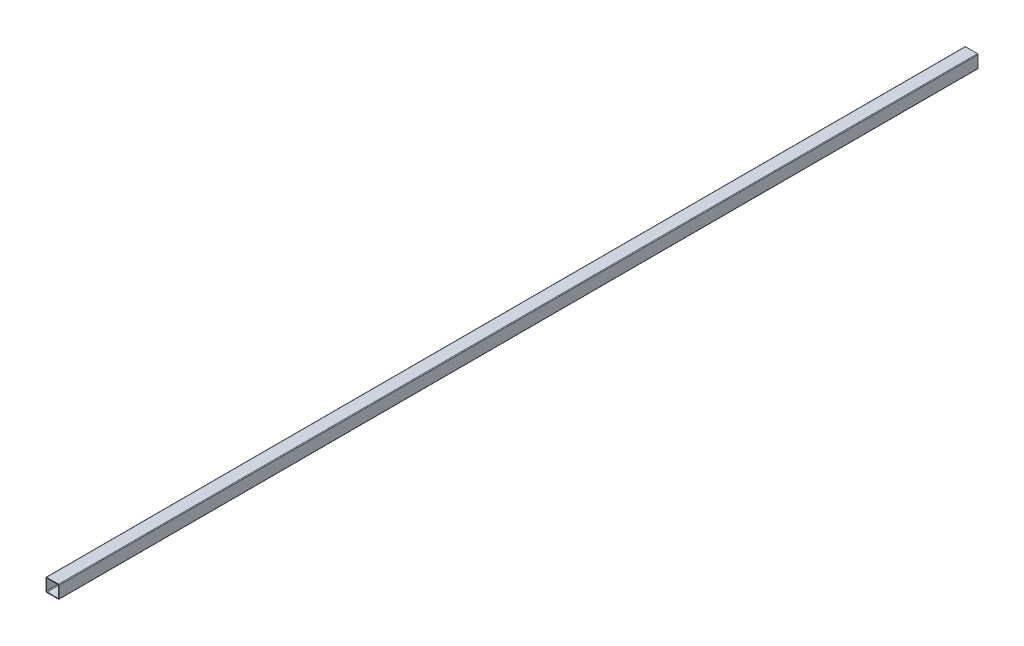
ISO-10303-21;
HEADER;
FILE_DESCRIPTION(('STEP AP214'),'2;1');
FILE_NAME('part.step','',(''),(''),'','','');
FILE_SCHEMA(('AUTOMOTIVE_DESIGN { 1 0 10303 214 1 1 1 1 }'));
ENDSEC;
DATA;
#1=APPLICATION_CONTEXT('core data for automotive mechanical design processes');
#2=APPLICATION_PROTOCOL_DEFINITION('international standard','automotive_design',2000,#1);
#3=PRODUCT_CONTEXT('',#1,'mechanical');
#4=PRODUCT('Part','Part','',(#3));
#5=PRODUCT_RELATED_PRODUCT_CATEGORY('part','',(#4));
#6=PRODUCT_DEFINITION_FORMATION('','',#4);
#7=PRODUCT_DEFINITION_CONTEXT('part definition',#1,'design');
#8=PRODUCT_DEFINITION('design','',#6,#7);
#9=PRODUCT_DEFINITION_SHAPE('','',#8);
#10=(LENGTH_UNIT() NAMED_UNIT(*) SI_UNIT(.MILLI.,.METRE.));
#11=(NAMED_UNIT(*) PLANE_ANGLE_UNIT() SI_UNIT($,.RADIAN.));
#12=(NAMED_UNIT(*) SI_UNIT($,.STERADIAN.) SOLID_ANGLE_UNIT());
#13=UNCERTAINTY_MEASURE_WITH_UNIT(LENGTH_MEASURE(1.E-05),#10,'distance_accuracy_value','');
#14=(GEOMETRIC_REPRESENTATION_CONTEXT(3) GLOBAL_UNCERTAINTY_ASSIGNED_CONTEXT((#13)) GLOBAL_UNIT_ASSIGNED_CONTEXT((#10,
#11,#12)) REPRESENTATION_CONTEXT('',''));
#15=CARTESIAN_POINT('',(0.,0.,0.));
#16=DIRECTION('',(0.,0.,1.));
#17=DIRECTION('',(1.,0.,0.));
#18=AXIS2_PLACEMENT_3D('',#15,#16,#17);
#19=CARTESIAN_POINT('',(18.,18.,2800.));
#20=DIRECTION('',(0.,0.,1.));
#21=DIRECTION('',(1.,0.,0.));
#22=AXIS2_PLACEMENT_3D('',#19,#20,#21);
#23=PLANE('',#22);
#24=CARTESIAN_POINT('',(18.,18.,2800.));
#25=DIRECTION('',(0.,0.,1.));
#26=DIRECTION('',(1.,0.,0.));
#27=AXIS2_PLACEMENT_3D('',#24,#25,#26);
#28=CIRCLE('',#27,2.);
#29=CARTESIAN_POINT('',(20.,18.,2800.));
#30=VERTEX_POINT('',#29);
#31=CARTESIAN_POINT('',(18.,20.,2800.));
#32=VERTEX_POINT('',#31);
#33=EDGE_CURVE('E212',#30,#32,#28,.T.);
#34=ORIENTED_EDGE('',*,*,#33,.T.);
#35=DIRECTION('',(-1.,0.,0.));
#36=VECTOR('',#35,1.);
#37=CARTESIAN_POINT('',(18.,20.,2800.));
#38=LINE('',#37,#36);
#39=CARTESIAN_POINT('',(-18.,20.,2800.));
#40=VERTEX_POINT('',#39);
#41=EDGE_CURVE('E215',#32,#40,#38,.T.);
#42=ORIENTED_EDGE('',*,*,#41,.T.);
#43=CARTESIAN_POINT('',(-18.,18.,2800.));
#44=DIRECTION('',(0.,0.,1.));
#45=DIRECTION('',(1.,0.,0.));
#46=AXIS2_PLACEMENT_3D('',#43,#44,#45);
#47=CIRCLE('',#46,2.);
#48=CARTESIAN_POINT('',(-20.,18.,2800.));
#49=VERTEX_POINT('',#48);
#50=EDGE_CURVE('E218',#40,#49,#47,.T.);
#51=ORIENTED_EDGE('',*,*,#50,.T.);
#52=DIRECTION('',(0.,-1.,0.));
#53=VECTOR('',#52,1.);
#54=CARTESIAN_POINT('',(-20.,-18.,2800.));
#55=LINE('',#54,#53);
#56=CARTESIAN_POINT('',(-20.,-18.,2800.));
#57=VERTEX_POINT('',#56);
#58=EDGE_CURVE('E220',#49,#57,#55,.T.);
#59=ORIENTED_EDGE('',*,*,#58,.T.);
#60=CARTESIAN_POINT('',(-18.,-18.,2800.));
#61=DIRECTION('',(0.,0.,1.));
#62=DIRECTION('',(-1.,0.,0.));
#63=AXIS2_PLACEMENT_3D('',#60,#61,#62);
#64=CIRCLE('',#63,2.);
#65=CARTESIAN_POINT('',(-18.,-20.,2800.));
#66=VERTEX_POINT('',#65);
#67=EDGE_CURVE('E222',#57,#66,#64,.T.);
#68=ORIENTED_EDGE('',*,*,#67,.T.);
#69=DIRECTION('',(1.,0.,0.));
#70=VECTOR('',#69,1.);
#71=CARTESIAN_POINT('',(18.,-20.,2800.));
#72=LINE('',#71,#70);
#73=CARTESIAN_POINT('',(18.,-20.,2800.));
#74=VERTEX_POINT('',#73);
#75=EDGE_CURVE('E224',#66,#74,#72,.T.);
#76=ORIENTED_EDGE('',*,*,#75,.T.);
#77=CARTESIAN_POINT('',(18.,-18.,2800.));
#78=DIRECTION('',(0.,0.,1.));
#79=DIRECTION('',(1.,0.,0.));
#80=AXIS2_PLACEMENT_3D('',#77,#78,#79);
#81=CIRCLE('',#80,2.);
#82=CARTESIAN_POINT('',(20.,-18.,2800.));
#83=VERTEX_POINT('',#82);
#84=EDGE_CURVE('E226',#74,#83,#81,.T.);
#85=ORIENTED_EDGE('',*,*,#84,.T.);
#86=DIRECTION('',(0.,1.,0.));
#87=VECTOR('',#86,1.);
#88=CARTESIAN_POINT('',(20.,-18.,2800.));
#89=LINE('',#88,#87);
#90=EDGE_CURVE('E228',#83,#30,#89,.T.);
#91=ORIENTED_EDGE('',*,*,#90,.T.);
#92=EDGE_LOOP('',(#34,#42,#51,#59,#68,#76,#85,#91));
#93=FACE_BOUND('',#92,.T.);
#94=DIRECTION('',(-1.,0.,0.));
#95=VECTOR('',#94,1.);
#96=CARTESIAN_POINT('',(16.,18.,2800.));
#97=LINE('',#96,#95);
#98=CARTESIAN_POINT('',(16.,18.,2800.));
#99=VERTEX_POINT('',#98);
#100=CARTESIAN_POINT('',(-16.,18.,2800.));
#101=VERTEX_POINT('',#100);
#102=EDGE_CURVE('E155',#99,#101,#97,.T.);
#103=ORIENTED_EDGE('',*,*,#102,.F.);
#104=CARTESIAN_POINT('',(16.,16.,2800.));
#105=DIRECTION('',(0.,0.,1.));
#106=DIRECTION('',(1.,0.,0.));
#107=AXIS2_PLACEMENT_3D('',#104,#105,#106);
#108=CIRCLE('',#107,2.);
#109=CARTESIAN_POINT('',(18.,16.,2800.));
#110=VERTEX_POINT('',#109);
#111=EDGE_CURVE('E147',#110,#99,#108,.T.);
#112=ORIENTED_EDGE('',*,*,#111,.F.);
#113=DIRECTION('',(0.,1.,0.));
#114=VECTOR('',#113,1.);
#115=CARTESIAN_POINT('',(18.,-16.,2800.));
#116=LINE('',#115,#114);
#117=CARTESIAN_POINT('',(18.,-16.,2800.));
#118=VERTEX_POINT('',#117);
#119=EDGE_CURVE('E180',#118,#110,#116,.T.);
#120=ORIENTED_EDGE('',*,*,#119,.F.);
#121=CARTESIAN_POINT('',(16.,-16.,2800.));
#122=DIRECTION('',(0.,0.,1.));
#123=DIRECTION('',(1.,0.,0.));
#124=AXIS2_PLACEMENT_3D('',#121,#122,#123);
#125=CIRCLE('',#124,2.);
#126=CARTESIAN_POINT('',(16.,-18.,2800.));
#127=VERTEX_POINT('',#126);
#128=EDGE_CURVE('E178',#127,#118,#125,.T.);
#129=ORIENTED_EDGE('',*,*,#128,.F.);
#130=DIRECTION('',(1.,0.,0.));
#131=VECTOR('',#130,1.);
#132=CARTESIAN_POINT('',(16.,-18.,2800.));
#133=LINE('',#132,#131);
#134=CARTESIAN_POINT('',(-16.,-18.,2800.));
#135=VERTEX_POINT('',#134);
#136=EDGE_CURVE('E176',#135,#127,#133,.T.);
#137=ORIENTED_EDGE('',*,*,#136,.F.);
#138=CARTESIAN_POINT('',(-16.,-16.,2800.));
#139=DIRECTION('',(0.,0.,1.));
#140=DIRECTION('',(-1.,0.,0.));
#141=AXIS2_PLACEMENT_3D('',#138,#139,#140);
#142=CIRCLE('',#141,2.);
#143=CARTESIAN_POINT('',(-18.,-16.,2800.));
#144=VERTEX_POINT('',#143);
#145=EDGE_CURVE('E174',#144,#135,#142,.T.);
#146=ORIENTED_EDGE('',*,*,#145,.F.);
#147=DIRECTION('',(0.,-1.,0.));
#148=VECTOR('',#147,1.);
#149=CARTESIAN_POINT('',(-18.,-16.,2800.));
#150=LINE('',#149,#148);
#151=CARTESIAN_POINT('',(-18.,16.,2800.));
#152=VERTEX_POINT('',#151);
#153=EDGE_CURVE('E170',#152,#144,#150,.T.);
#154=ORIENTED_EDGE('',*,*,#153,.F.);
#155=CARTESIAN_POINT('',(-16.,16.,2800.));
#156=DIRECTION('',(0.,0.,1.));
#157=DIRECTION('',(1.,0.,0.));
#158=AXIS2_PLACEMENT_3D('',#155,#156,#157);
#159=CIRCLE('',#158,2.);
#160=EDGE_CURVE('E168',#101,#152,#159,.T.);
#161=ORIENTED_EDGE('',*,*,#160,.F.);
#162=EDGE_LOOP('',(#103,#112,#120,#129,#137,#146,#154,#161));
#163=FACE_BOUND('',#162,.T.);
#164=ADVANCED_FACE('F34',(#93,#163),#23,.T.);
#165=CARTESIAN_POINT('',(18.,18.,0.));
#166=DIRECTION('',(0.,0.,1.));
#167=DIRECTION('',(1.,0.,0.));
#168=AXIS2_PLACEMENT_3D('',#165,#166,#167);
#169=PLANE('',#168);
#170=CARTESIAN_POINT('',(18.,18.,0.));
#171=DIRECTION('',(0.,0.,1.));
#172=DIRECTION('',(1.,0.,0.));
#173=AXIS2_PLACEMENT_3D('',#170,#171,#172);
#174=CIRCLE('',#173,2.);
#175=CARTESIAN_POINT('',(20.,18.,0.));
#176=VERTEX_POINT('',#175);
#177=CARTESIAN_POINT('',(18.,20.,0.));
#178=VERTEX_POINT('',#177);
#179=EDGE_CURVE('E163',#176,#178,#174,.T.);
#180=ORIENTED_EDGE('',*,*,#179,.F.);
#181=DIRECTION('',(0.,1.,0.));
#182=VECTOR('',#181,1.);
#183=CARTESIAN_POINT('',(20.,-18.,0.));
#184=LINE('',#183,#182);
#185=CARTESIAN_POINT('',(20.,-18.,0.));
#186=VERTEX_POINT('',#185);
#187=EDGE_CURVE('E216',#186,#176,#184,.T.);
#188=ORIENTED_EDGE('',*,*,#187,.F.);
#189=CARTESIAN_POINT('',(18.,-18.,0.));
#190=DIRECTION('',(0.,0.,1.));
#191=DIRECTION('',(1.,0.,0.));
#192=AXIS2_PLACEMENT_3D('',#189,#190,#191);
#193=CIRCLE('',#192,2.);
#194=CARTESIAN_POINT('',(18.,-20.,0.));
#195=VERTEX_POINT('',#194);
#196=EDGE_CURVE('E243',#195,#186,#193,.T.);
#197=ORIENTED_EDGE('',*,*,#196,.F.);
#198=DIRECTION('',(1.,0.,0.));
#199=VECTOR('',#198,1.);
#200=CARTESIAN_POINT('',(18.,-20.,0.));
#201=LINE('',#200,#199);
#202=CARTESIAN_POINT('',(-18.,-20.,0.));
#203=VERTEX_POINT('',#202);
#204=EDGE_CURVE('E241',#203,#195,#201,.T.);
#205=ORIENTED_EDGE('',*,*,#204,.F.);
#206=CARTESIAN_POINT('',(-18.,-18.,0.));
#207=DIRECTION('',(0.,0.,1.));
#208=DIRECTION('',(-1.,0.,0.));
#209=AXIS2_PLACEMENT_3D('',#206,#207,#208);
#210=CIRCLE('',#209,2.);
#211=CARTESIAN_POINT('',(-20.,-18.,0.));
#212=VERTEX_POINT('',#211);
#213=EDGE_CURVE('E239',#212,#203,#210,.T.);
#214=ORIENTED_EDGE('',*,*,#213,.F.);
#215=DIRECTION('',(0.,-1.,0.));
#216=VECTOR('',#215,1.);
#217=CARTESIAN_POINT('',(-20.,-18.,0.));
#218=LINE('',#217,#216);
#219=CARTESIAN_POINT('',(-20.,18.,0.));
#220=VERTEX_POINT('',#219);
#221=EDGE_CURVE('E237',#220,#212,#218,.T.);
#222=ORIENTED_EDGE('',*,*,#221,.F.);
#223=CARTESIAN_POINT('',(-18.,18.,0.));
#224=DIRECTION('',(0.,0.,1.));
#225=DIRECTION('',(1.,0.,0.));
#226=AXIS2_PLACEMENT_3D('',#223,#224,#225);
#227=CIRCLE('',#226,2.);
#228=CARTESIAN_POINT('',(-18.,20.,0.));
#229=VERTEX_POINT('',#228);
#230=EDGE_CURVE('E235',#229,#220,#227,.T.);
#231=ORIENTED_EDGE('',*,*,#230,.F.);
#232=DIRECTION('',(-1.,0.,0.));
#233=VECTOR('',#232,1.);
#234=CARTESIAN_POINT('',(18.,20.,0.));
#235=LINE('',#234,#233);
#236=EDGE_CURVE('E233',#178,#229,#235,.T.);
#237=ORIENTED_EDGE('',*,*,#236,.F.);
#238=EDGE_LOOP('',(#180,#188,#197,#205,#214,#222,#231,#237));
#239=FACE_BOUND('',#238,.T.);
#240=CARTESIAN_POINT('',(16.,16.,0.));
#241=DIRECTION('',(0.,0.,1.));
#242=DIRECTION('',(1.,0.,0.));
#243=AXIS2_PLACEMENT_3D('',#240,#241,#242);
#244=CIRCLE('',#243,2.);
#245=CARTESIAN_POINT('',(18.,16.,0.));
#246=VERTEX_POINT('',#245);
#247=CARTESIAN_POINT('',(16.,18.,0.));
#248=VERTEX_POINT('',#247);
#249=EDGE_CURVE('E57',#246,#248,#244,.T.);
#250=ORIENTED_EDGE('',*,*,#249,.T.);
#251=DIRECTION('',(-1.,0.,0.));
#252=VECTOR('',#251,1.);
#253=CARTESIAN_POINT('',(16.,18.,0.));
#254=LINE('',#253,#252);
#255=CARTESIAN_POINT('',(-16.,18.,0.));
#256=VERTEX_POINT('',#255);
#257=EDGE_CURVE('E162',#248,#256,#254,.T.);
#258=ORIENTED_EDGE('',*,*,#257,.T.);
#259=CARTESIAN_POINT('',(-16.,16.,0.));
#260=DIRECTION('',(0.,0.,1.));
#261=DIRECTION('',(1.,0.,0.));
#262=AXIS2_PLACEMENT_3D('',#259,#260,#261);
#263=CIRCLE('',#262,2.);
#264=CARTESIAN_POINT('',(-18.,16.,0.));
#265=VERTEX_POINT('',#264);
#266=EDGE_CURVE('E184',#256,#265,#263,.T.);
#267=ORIENTED_EDGE('',*,*,#266,.T.);
#268=DIRECTION('',(0.,-1.,0.));
#269=VECTOR('',#268,1.);
#270=CARTESIAN_POINT('',(-18.,-16.,0.));
#271=LINE('',#270,#269);
#272=CARTESIAN_POINT('',(-18.,-16.,0.));
#273=VERTEX_POINT('',#272);
#274=EDGE_CURVE('E187',#265,#273,#271,.T.);
#275=ORIENTED_EDGE('',*,*,#274,.T.);
#276=CARTESIAN_POINT('',(-16.,-16.,0.));
#277=DIRECTION('',(0.,0.,1.));
#278=DIRECTION('',(-1.,0.,0.));
#279=AXIS2_PLACEMENT_3D('',#276,#277,#278);
#280=CIRCLE('',#279,2.);
#281=CARTESIAN_POINT('',(-16.,-18.,0.));
#282=VERTEX_POINT('',#281);
#283=EDGE_CURVE('E190',#273,#282,#280,.T.);
#284=ORIENTED_EDGE('',*,*,#283,.T.);
#285=DIRECTION('',(1.,0.,0.));
#286=VECTOR('',#285,1.);
#287=CARTESIAN_POINT('',(16.,-18.,0.));
#288=LINE('',#287,#286);
#289=CARTESIAN_POINT('',(16.,-18.,0.));
#290=VERTEX_POINT('',#289);
#291=EDGE_CURVE('E193',#282,#290,#288,.T.);
#292=ORIENTED_EDGE('',*,*,#291,.T.);
#293=CARTESIAN_POINT('',(16.,-16.,0.));
#294=DIRECTION('',(0.,0.,1.));
#295=DIRECTION('',(1.,0.,0.));
#296=AXIS2_PLACEMENT_3D('',#293,#294,#295);
#297=CIRCLE('',#296,2.);
#298=CARTESIAN_POINT('',(18.,-16.,0.));
#299=VERTEX_POINT('',#298);
#300=EDGE_CURVE('E196',#290,#299,#297,.T.);
#301=ORIENTED_EDGE('',*,*,#300,.T.);
#302=DIRECTION('',(0.,1.,0.));
#303=VECTOR('',#302,1.);
#304=CARTESIAN_POINT('',(18.,-16.,0.));
#305=LINE('',#304,#303);
#306=EDGE_CURVE('E156',#299,#246,#305,.T.);
#307=ORIENTED_EDGE('',*,*,#306,.T.);
#308=EDGE_LOOP('',(#250,#258,#267,#275,#284,#292,#301,#307));
#309=FACE_BOUND('',#308,.T.);
#310=ADVANCED_FACE('F273',(#239,#309),#169,.F.);
#311=CARTESIAN_POINT('',(18.,18.,2800.));
#312=DIRECTION('',(0.,0.,-1.));
#313=DIRECTION('',(-1.,0.,0.));
#314=AXIS2_PLACEMENT_3D('',#311,#312,#313);
#315=CYLINDRICAL_SURFACE('',#314,2.);
#316=ORIENTED_EDGE('',*,*,#179,.T.);
#317=DIRECTION('',(0.,0.,-1.));
#318=VECTOR('',#317,1.);
#319=CARTESIAN_POINT('',(18.,20.,2800.));
#320=LINE('',#319,#318);
#321=EDGE_CURVE('E11',#32,#178,#320,.T.);
#322=ORIENTED_EDGE('',*,*,#321,.F.);
#323=ORIENTED_EDGE('',*,*,#33,.F.);
#324=DIRECTION('',(0.,0.,-1.));
#325=VECTOR('',#324,1.);
#326=CARTESIAN_POINT('',(20.,18.,2800.));
#327=LINE('',#326,#325);
#328=EDGE_CURVE('E230',#30,#176,#327,.T.);
#329=ORIENTED_EDGE('',*,*,#328,.T.);
#330=EDGE_LOOP('',(#316,#322,#323,#329));
#331=FACE_BOUND('',#330,.T.);
#332=ADVANCED_FACE('F36',(#331),#315,.T.);
#333=CARTESIAN_POINT('',(18.,20.,2800.));
#334=DIRECTION('',(0.,-1.,0.));
#335=DIRECTION('',(0.,0.,-1.));
#336=AXIS2_PLACEMENT_3D('',#333,#334,#335);
#337=PLANE('',#336);
#338=ORIENTED_EDGE('',*,*,#236,.T.);
#339=DIRECTION('',(0.,0.,-1.));
#340=VECTOR('',#339,1.);
#341=CARTESIAN_POINT('',(-18.,20.,2800.));
#342=LINE('',#341,#340);
#343=EDGE_CURVE('E42',#40,#229,#342,.T.);
#344=ORIENTED_EDGE('',*,*,#343,.F.);
#345=ORIENTED_EDGE('',*,*,#41,.F.);
#346=ORIENTED_EDGE('',*,*,#321,.T.);
#347=EDGE_LOOP('',(#338,#344,#345,#346));
#348=FACE_BOUND('',#347,.T.);
#349=ADVANCED_FACE('F290',(#348),#337,.F.);
#350=CARTESIAN_POINT('',(-18.,18.,2800.));
#351=DIRECTION('',(0.,0.,-1.));
#352=DIRECTION('',(-1.,0.,0.));
#353=AXIS2_PLACEMENT_3D('',#350,#351,#352);
#354=CYLINDRICAL_SURFACE('',#353,2.);
#355=ORIENTED_EDGE('',*,*,#230,.T.);
#356=DIRECTION('',(0.,0.,-1.));
#357=VECTOR('',#356,1.);
#358=CARTESIAN_POINT('',(-20.,18.,2800.));
#359=LINE('',#358,#357);
#360=EDGE_CURVE('E260',#49,#220,#359,.T.);
#361=ORIENTED_EDGE('',*,*,#360,.F.);
#362=ORIENTED_EDGE('',*,*,#50,.F.);
#363=ORIENTED_EDGE('',*,*,#343,.T.);
#364=EDGE_LOOP('',(#355,#361,#362,#363));
#365=FACE_BOUND('',#364,.T.);
#366=ADVANCED_FACE('F267',(#365),#354,.T.);
#367=CARTESIAN_POINT('',(-20.,-18.,2800.));
#368=DIRECTION('',(1.,0.,0.));
#369=DIRECTION('',(0.,0.,-1.));
#370=AXIS2_PLACEMENT_3D('',#367,#368,#369);
#371=PLANE('',#370);
#372=ORIENTED_EDGE('',*,*,#221,.T.);
#373=DIRECTION('',(0.,0.,-1.));
#374=VECTOR('',#373,1.);
#375=CARTESIAN_POINT('',(-20.,-18.,2800.));
#376=LINE('',#375,#374);
#377=EDGE_CURVE('E257',#57,#212,#376,.T.);
#378=ORIENTED_EDGE('',*,*,#377,.F.);
#379=ORIENTED_EDGE('',*,*,#58,.F.);
#380=ORIENTED_EDGE('',*,*,#360,.T.);
#381=EDGE_LOOP('',(#372,#378,#379,#380));
#382=FACE_BOUND('',#381,.T.);
#383=ADVANCED_FACE('F279',(#382),#371,.F.);
#384=CARTESIAN_POINT('',(-18.,-18.,2800.));
#385=DIRECTION('',(0.,0.,-1.));
#386=DIRECTION('',(-1.,0.,0.));
#387=AXIS2_PLACEMENT_3D('',#384,#385,#386);
#388=CYLINDRICAL_SURFACE('',#387,2.);
#389=ORIENTED_EDGE('',*,*,#213,.T.);
#390=DIRECTION('',(0.,0.,-1.));
#391=VECTOR('',#390,1.);
#392=CARTESIAN_POINT('',(-18.,-20.,2800.));
#393=LINE('',#392,#391);
#394=EDGE_CURVE('E254',#66,#203,#393,.T.);
#395=ORIENTED_EDGE('',*,*,#394,.F.);
#396=ORIENTED_EDGE('',*,*,#67,.F.);
#397=ORIENTED_EDGE('',*,*,#377,.T.);
#398=EDGE_LOOP('',(#389,#395,#396,#397));
#399=FACE_BOUND('',#398,.T.);
#400=ADVANCED_FACE('F283',(#399),#388,.T.);
#401=CARTESIAN_POINT('',(18.,-20.,2800.));
#402=DIRECTION('',(0.,1.,0.));
#403=DIRECTION('',(0.,0.,1.));
#404=AXIS2_PLACEMENT_3D('',#401,#402,#403);
#405=PLANE('',#404);
#406=ORIENTED_EDGE('',*,*,#204,.T.);
#407=DIRECTION('',(0.,0.,-1.));
#408=VECTOR('',#407,1.);
#409=CARTESIAN_POINT('',(18.,-20.,2800.));
#410=LINE('',#409,#408);
#411=EDGE_CURVE('E251',#74,#195,#410,.T.);
#412=ORIENTED_EDGE('',*,*,#411,.F.);
#413=ORIENTED_EDGE('',*,*,#75,.F.);
#414=ORIENTED_EDGE('',*,*,#394,.T.);
#415=EDGE_LOOP('',(#406,#412,#413,#414));
#416=FACE_BOUND('',#415,.T.);
#417=ADVANCED_FACE('F303',(#416),#405,.F.);
#418=CARTESIAN_POINT('',(18.,-18.,2800.));
#419=DIRECTION('',(0.,0.,-1.));
#420=DIRECTION('',(-1.,0.,0.));
#421=AXIS2_PLACEMENT_3D('',#418,#419,#420);
#422=CYLINDRICAL_SURFACE('',#421,2.);
#423=ORIENTED_EDGE('',*,*,#196,.T.);
#424=DIRECTION('',(0.,0.,-1.));
#425=VECTOR('',#424,1.);
#426=CARTESIAN_POINT('',(20.,-18.,2800.));
#427=LINE('',#426,#425);
#428=EDGE_CURVE('E248',#83,#186,#427,.T.);
#429=ORIENTED_EDGE('',*,*,#428,.F.);
#430=ORIENTED_EDGE('',*,*,#84,.F.);
#431=ORIENTED_EDGE('',*,*,#411,.T.);
#432=EDGE_LOOP('',(#423,#429,#430,#431));
#433=FACE_BOUND('',#432,.T.);
#434=ADVANCED_FACE('F301',(#433),#422,.T.);
#435=CARTESIAN_POINT('',(20.,-18.,2800.));
#436=DIRECTION('',(-1.,0.,0.));
#437=DIRECTION('',(0.,-1.,0.));
#438=AXIS2_PLACEMENT_3D('',#435,#436,#437);
#439=PLANE('',#438);
#440=ORIENTED_EDGE('',*,*,#187,.T.);
#441=ORIENTED_EDGE('',*,*,#328,.F.);
#442=ORIENTED_EDGE('',*,*,#90,.F.);
#443=ORIENTED_EDGE('',*,*,#428,.T.);
#444=EDGE_LOOP('',(#440,#441,#442,#443));
#445=FACE_BOUND('',#444,.T.);
#446=ADVANCED_FACE('F296',(#445),#439,.F.);
#447=CARTESIAN_POINT('',(16.,16.,2800.));
#448=DIRECTION('',(0.,0.,-1.));
#449=DIRECTION('',(-1.,0.,0.));
#450=AXIS2_PLACEMENT_3D('',#447,#448,#449);
#451=CYLINDRICAL_SURFACE('',#450,2.);
#452=ORIENTED_EDGE('',*,*,#249,.F.);
#453=DIRECTION('',(0.,0.,-1.));
#454=VECTOR('',#453,1.);
#455=CARTESIAN_POINT('',(18.,16.,2800.));
#456=LINE('',#455,#454);
#457=EDGE_CURVE('E151',#110,#246,#456,.T.);
#458=ORIENTED_EDGE('',*,*,#457,.F.);
#459=ORIENTED_EDGE('',*,*,#111,.T.);
#460=DIRECTION('',(0.,0.,-1.));
#461=VECTOR('',#460,1.);
#462=CARTESIAN_POINT('',(16.,18.,2800.));
#463=LINE('',#462,#461);
#464=EDGE_CURVE('E150',#99,#248,#463,.T.);
#465=ORIENTED_EDGE('',*,*,#464,.T.);
#466=EDGE_LOOP('',(#452,#458,#459,#465));
#467=FACE_BOUND('',#466,.T.);
#468=ADVANCED_FACE('F149',(#467),#451,.F.);
#469=CARTESIAN_POINT('',(16.,18.,2800.));
#470=DIRECTION('',(0.,-1.,0.));
#471=DIRECTION('',(0.,0.,-1.));
#472=AXIS2_PLACEMENT_3D('',#469,#470,#471);
#473=PLANE('',#472);
#474=ORIENTED_EDGE('',*,*,#257,.F.);
#475=ORIENTED_EDGE('',*,*,#464,.F.);
#476=ORIENTED_EDGE('',*,*,#102,.T.);
#477=DIRECTION('',(0.,0.,-1.));
#478=VECTOR('',#477,1.);
#479=CARTESIAN_POINT('',(-16.,18.,2800.));
#480=LINE('',#479,#478);
#481=EDGE_CURVE('E164',#101,#256,#480,.T.);
#482=ORIENTED_EDGE('',*,*,#481,.T.);
#483=EDGE_LOOP('',(#474,#475,#476,#482));
#484=FACE_BOUND('',#483,.T.);
#485=ADVANCED_FACE('F159',(#484),#473,.T.);
#486=CARTESIAN_POINT('',(-16.,16.,2800.));
#487=DIRECTION('',(0.,0.,-1.));
#488=DIRECTION('',(-1.,0.,0.));
#489=AXIS2_PLACEMENT_3D('',#486,#487,#488);
#490=CYLINDRICAL_SURFACE('',#489,2.);
#491=ORIENTED_EDGE('',*,*,#266,.F.);
#492=ORIENTED_EDGE('',*,*,#481,.F.);
#493=ORIENTED_EDGE('',*,*,#160,.T.);
#494=DIRECTION('',(0.,0.,-1.));
#495=VECTOR('',#494,1.);
#496=CARTESIAN_POINT('',(-18.,16.,2800.));
#497=LINE('',#496,#495);
#498=EDGE_CURVE('E209',#152,#265,#497,.T.);
#499=ORIENTED_EDGE('',*,*,#498,.T.);
#500=EDGE_LOOP('',(#491,#492,#493,#499));
#501=FACE_BOUND('',#500,.T.);
#502=ADVANCED_FACE('F328',(#501),#490,.F.);
#503=CARTESIAN_POINT('',(-18.,-16.,2800.));
#504=DIRECTION('',(1.,0.,0.));
#505=DIRECTION('',(0.,0.,-1.));
#506=AXIS2_PLACEMENT_3D('',#503,#504,#505);
#507=PLANE('',#506);
#508=ORIENTED_EDGE('',*,*,#274,.F.);
#509=ORIENTED_EDGE('',*,*,#498,.F.);
#510=ORIENTED_EDGE('',*,*,#153,.T.);
#511=DIRECTION('',(0.,0.,-1.));
#512=VECTOR('',#511,1.);
#513=CARTESIAN_POINT('',(-18.,-16.,2800.));
#514=LINE('',#513,#512);
#515=EDGE_CURVE('E207',#144,#273,#514,.T.);
#516=ORIENTED_EDGE('',*,*,#515,.T.);
#517=EDGE_LOOP('',(#508,#509,#510,#516));
#518=FACE_BOUND('',#517,.T.);
#519=ADVANCED_FACE('F332',(#518),#507,.T.);
#520=CARTESIAN_POINT('',(-16.,-16.,2800.));
#521=DIRECTION('',(0.,0.,-1.));
#522=DIRECTION('',(-1.,0.,0.));
#523=AXIS2_PLACEMENT_3D('',#520,#521,#522);
#524=CYLINDRICAL_SURFACE('',#523,2.);
#525=ORIENTED_EDGE('',*,*,#283,.F.);
#526=ORIENTED_EDGE('',*,*,#515,.F.);
#527=ORIENTED_EDGE('',*,*,#145,.T.);
#528=DIRECTION('',(0.,0.,-1.));
#529=VECTOR('',#528,1.);
#530=CARTESIAN_POINT('',(-16.,-18.,2800.));
#531=LINE('',#530,#529);
#532=EDGE_CURVE('E205',#135,#282,#531,.T.);
#533=ORIENTED_EDGE('',*,*,#532,.T.);
#534=EDGE_LOOP('',(#525,#526,#527,#533));
#535=FACE_BOUND('',#534,.T.);
#536=ADVANCED_FACE('F338',(#535),#524,.F.);
#537=CARTESIAN_POINT('',(16.,-18.,2800.));
#538=DIRECTION('',(0.,1.,0.));
#539=DIRECTION('',(0.,0.,1.));
#540=AXIS2_PLACEMENT_3D('',#537,#538,#539);
#541=PLANE('',#540);
#542=ORIENTED_EDGE('',*,*,#291,.F.);
#543=ORIENTED_EDGE('',*,*,#532,.F.);
#544=ORIENTED_EDGE('',*,*,#136,.T.);
#545=DIRECTION('',(0.,0.,-1.));
#546=VECTOR('',#545,1.);
#547=CARTESIAN_POINT('',(16.,-18.,2800.));
#548=LINE('',#547,#546);
#549=EDGE_CURVE('E203',#127,#290,#548,.T.);
#550=ORIENTED_EDGE('',*,*,#549,.T.);
#551=EDGE_LOOP('',(#542,#543,#544,#550));
#552=FACE_BOUND('',#551,.T.);
#553=ADVANCED_FACE('F342',(#552),#541,.T.);
#554=CARTESIAN_POINT('',(16.,-16.,2800.));
#555=DIRECTION('',(0.,0.,-1.));
#556=DIRECTION('',(-1.,0.,0.));
#557=AXIS2_PLACEMENT_3D('',#554,#555,#556);
#558=CYLINDRICAL_SURFACE('',#557,2.);
#559=ORIENTED_EDGE('',*,*,#300,.F.);
#560=ORIENTED_EDGE('',*,*,#549,.F.);
#561=ORIENTED_EDGE('',*,*,#128,.T.);
#562=DIRECTION('',(0.,0.,-1.));
#563=VECTOR('',#562,1.);
#564=CARTESIAN_POINT('',(18.,-16.,2800.));
#565=LINE('',#564,#563);
#566=EDGE_CURVE('E49',#118,#299,#565,.T.);
#567=ORIENTED_EDGE('',*,*,#566,.T.);
#568=EDGE_LOOP('',(#559,#560,#561,#567));
#569=FACE_BOUND('',#568,.T.);
#570=ADVANCED_FACE('F346',(#569),#558,.F.);
#571=CARTESIAN_POINT('',(18.,-16.,2800.));
#572=DIRECTION('',(-1.,0.,0.));
#573=DIRECTION('',(0.,0.,1.));
#574=AXIS2_PLACEMENT_3D('',#571,#572,#573);
#575=PLANE('',#574);
#576=ORIENTED_EDGE('',*,*,#306,.F.);
#577=ORIENTED_EDGE('',*,*,#566,.F.);
#578=ORIENTED_EDGE('',*,*,#119,.T.);
#579=ORIENTED_EDGE('',*,*,#457,.T.);
#580=EDGE_LOOP('',(#576,#577,#578,#579));
#581=FACE_BOUND('',#580,.T.);
#582=ADVANCED_FACE('F350',(#581),#575,.T.);
#583=CLOSED_SHELL('',(#164,#310,#332,#349,#366,#383,#400,#417,#434,#446,#468,#485,#502,#519,
#536,#553,#570,#582));
#584=MANIFOLD_SOLID_BREP('B2',#583);
#585=ADVANCED_BREP_SHAPE_REPRESENTATION('',(#18,#584),#14);
#586=SHAPE_DEFINITION_REPRESENTATION(#9,#585);
ENDSEC;
END-ISO-10303-21;
